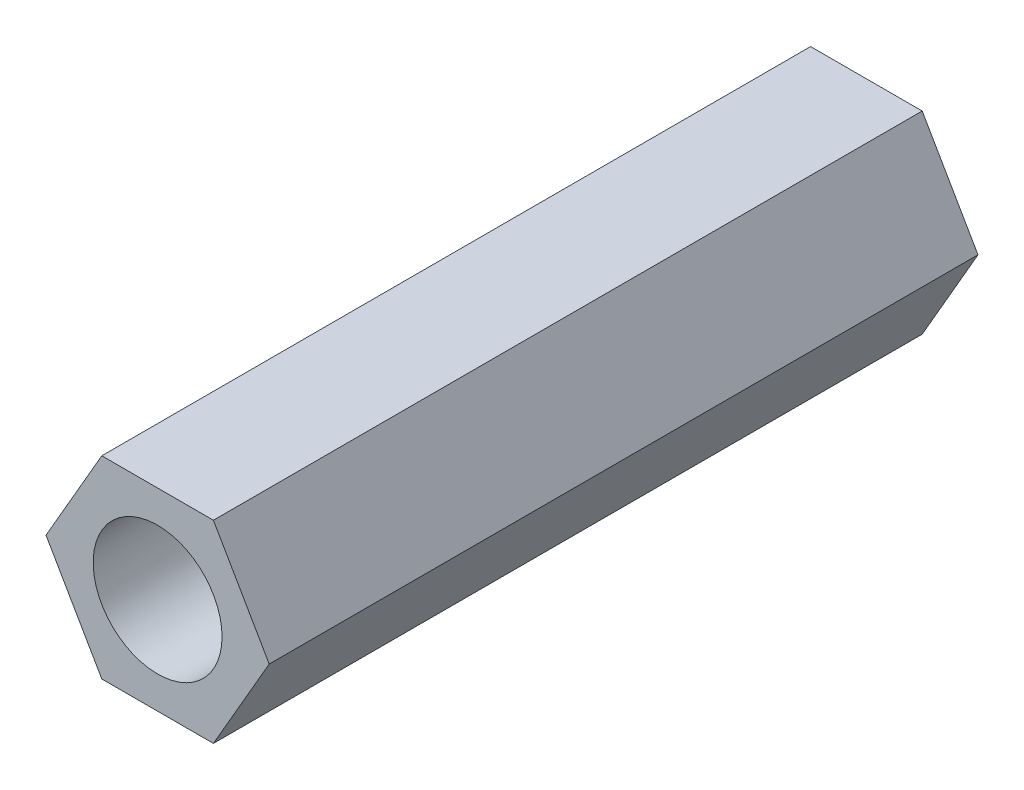
ISO-10303-21;
HEADER;
FILE_DESCRIPTION(('STEP AP214'),'2;1');
FILE_NAME('part.step','',(''),(''),'','','');
FILE_SCHEMA(('AUTOMOTIVE_DESIGN { 1 0 10303 214 1 1 1 1 }'));
ENDSEC;
DATA;
#1=APPLICATION_CONTEXT('core data for automotive mechanical design processes');
#2=APPLICATION_PROTOCOL_DEFINITION('international standard','automotive_design',2000,#1);
#3=PRODUCT_CONTEXT('',#1,'mechanical');
#4=PRODUCT('Part','Part','',(#3));
#5=PRODUCT_RELATED_PRODUCT_CATEGORY('part','',(#4));
#6=PRODUCT_DEFINITION_FORMATION('','',#4);
#7=PRODUCT_DEFINITION_CONTEXT('part definition',#1,'design');
#8=PRODUCT_DEFINITION('design','',#6,#7);
#9=PRODUCT_DEFINITION_SHAPE('','',#8);
#10=(LENGTH_UNIT() NAMED_UNIT(*) SI_UNIT(.MILLI.,.METRE.));
#11=(NAMED_UNIT(*) PLANE_ANGLE_UNIT() SI_UNIT($,.RADIAN.));
#12=(NAMED_UNIT(*) SI_UNIT($,.STERADIAN.) SOLID_ANGLE_UNIT());
#13=UNCERTAINTY_MEASURE_WITH_UNIT(LENGTH_MEASURE(1.E-05),#10,'distance_accuracy_value','');
#14=(GEOMETRIC_REPRESENTATION_CONTEXT(3) GLOBAL_UNCERTAINTY_ASSIGNED_CONTEXT((#13)) GLOBAL_UNIT_ASSIGNED_CONTEXT((#10,
#11,#12)) REPRESENTATION_CONTEXT('',''));
#15=CARTESIAN_POINT('',(0.,0.,0.));
#16=DIRECTION('',(0.,0.,1.));
#17=DIRECTION('',(1.,0.,0.));
#18=AXIS2_PLACEMENT_3D('',#15,#16,#17);
#19=CARTESIAN_POINT('',(0.,0.,22.));
#20=DIRECTION('',(0.,0.,1.));
#21=DIRECTION('',(1.,0.,0.));
#22=AXIS2_PLACEMENT_3D('',#19,#20,#21);
#23=PLANE('',#22);
#24=DIRECTION('',(-0.5,-0.866025403784439,0.));
#25=VECTOR('',#24,1.);
#26=CARTESIAN_POINT('',(-1.73205080756888,3.,22.));
#27=LINE('',#26,#25);
#28=CARTESIAN_POINT('',(-1.73205080756888,3.,22.));
#29=VERTEX_POINT('',#28);
#30=CARTESIAN_POINT('',(-3.46410161513775,0.,22.));
#31=VERTEX_POINT('',#30);
#32=EDGE_CURVE('E130',#29,#31,#27,.T.);
#33=ORIENTED_EDGE('',*,*,#32,.T.);
#34=DIRECTION('',(0.5,-0.866025403784439,0.));
#35=VECTOR('',#34,1.);
#36=CARTESIAN_POINT('',(-3.46410161513775,0.,22.));
#37=LINE('',#36,#35);
#38=CARTESIAN_POINT('',(-1.73205080756888,-3.,22.));
#39=VERTEX_POINT('',#38);
#40=EDGE_CURVE('E88',#31,#39,#37,.T.);
#41=ORIENTED_EDGE('',*,*,#40,.T.);
#42=DIRECTION('',(1.,0.,0.));
#43=VECTOR('',#42,1.);
#44=CARTESIAN_POINT('',(-1.73205080756888,-3.,22.));
#45=LINE('',#44,#43);
#46=CARTESIAN_POINT('',(1.73205080756888,-3.,22.));
#47=VERTEX_POINT('',#46);
#48=EDGE_CURVE('E101',#39,#47,#45,.T.);
#49=ORIENTED_EDGE('',*,*,#48,.T.);
#50=DIRECTION('',(0.5,0.866025403784439,0.));
#51=VECTOR('',#50,1.);
#52=CARTESIAN_POINT('',(1.73205080756888,-3.,22.));
#53=LINE('',#52,#51);
#54=CARTESIAN_POINT('',(3.46410161513775,0.,22.));
#55=VERTEX_POINT('',#54);
#56=EDGE_CURVE('E95',#47,#55,#53,.T.);
#57=ORIENTED_EDGE('',*,*,#56,.T.);
#58=DIRECTION('',(-0.5,0.866025403784439,0.));
#59=VECTOR('',#58,1.);
#60=CARTESIAN_POINT('',(3.46410161513775,0.,22.));
#61=LINE('',#60,#59);
#62=CARTESIAN_POINT('',(1.73205080756888,3.,22.));
#63=VERTEX_POINT('',#62);
#64=EDGE_CURVE('E99',#55,#63,#61,.T.);
#65=ORIENTED_EDGE('',*,*,#64,.T.);
#66=DIRECTION('',(-1.,0.,0.));
#67=VECTOR('',#66,1.);
#68=CARTESIAN_POINT('',(1.73205080756888,3.,22.));
#69=LINE('',#68,#67);
#70=EDGE_CURVE('E51',#63,#29,#69,.T.);
#71=ORIENTED_EDGE('',*,*,#70,.T.);
#72=EDGE_LOOP('',(#33,#41,#49,#57,#65,#71));
#73=FACE_BOUND('',#72,.T.);
#74=CARTESIAN_POINT('',(0.,0.,22.));
#75=DIRECTION('',(0.,0.,1.));
#76=DIRECTION('',(1.,0.,0.));
#77=AXIS2_PLACEMENT_3D('',#74,#75,#76);
#78=CIRCLE('',#77,2.);
#79=CARTESIAN_POINT('',(2.,0.,22.));
#80=VERTEX_POINT('',#79);
#81=EDGE_CURVE('E123',#80,#80,#78,.T.);
#82=ORIENTED_EDGE('',*,*,#81,.F.);
#83=EDGE_LOOP('',(#82));
#84=FACE_BOUND('',#83,.T.);
#85=ADVANCED_FACE('F34',(#73,#84),#23,.T.);
#86=CARTESIAN_POINT('',(0.,0.,0.));
#87=DIRECTION('',(0.,0.,1.));
#88=DIRECTION('',(1.,0.,0.));
#89=AXIS2_PLACEMENT_3D('',#86,#87,#88);
#90=PLANE('',#89);
#91=DIRECTION('',(-0.5,-0.866025403784439,0.));
#92=VECTOR('',#91,1.);
#93=CARTESIAN_POINT('',(-1.73205080756888,3.,0.));
#94=LINE('',#93,#92);
#95=CARTESIAN_POINT('',(-1.73205080756888,3.,0.));
#96=VERTEX_POINT('',#95);
#97=CARTESIAN_POINT('',(-3.46410161513775,0.,0.));
#98=VERTEX_POINT('',#97);
#99=EDGE_CURVE('E119',#96,#98,#94,.T.);
#100=ORIENTED_EDGE('',*,*,#99,.F.);
#101=DIRECTION('',(-1.,0.,0.));
#102=VECTOR('',#101,1.);
#103=CARTESIAN_POINT('',(1.73205080756888,3.,0.));
#104=LINE('',#103,#102);
#105=CARTESIAN_POINT('',(1.73205080756888,3.,0.));
#106=VERTEX_POINT('',#105);
#107=EDGE_CURVE('E80',#106,#96,#104,.T.);
#108=ORIENTED_EDGE('',*,*,#107,.F.);
#109=DIRECTION('',(-0.5,0.866025403784439,0.));
#110=VECTOR('',#109,1.);
#111=CARTESIAN_POINT('',(3.46410161513775,0.,0.));
#112=LINE('',#111,#110);
#113=CARTESIAN_POINT('',(3.46410161513775,0.,0.));
#114=VERTEX_POINT('',#113);
#115=EDGE_CURVE('E74',#114,#106,#112,.T.);
#116=ORIENTED_EDGE('',*,*,#115,.F.);
#117=DIRECTION('',(0.5,0.866025403784439,0.));
#118=VECTOR('',#117,1.);
#119=CARTESIAN_POINT('',(1.73205080756888,-3.,0.));
#120=LINE('',#119,#118);
#121=CARTESIAN_POINT('',(1.73205080756888,-3.,0.));
#122=VERTEX_POINT('',#121);
#123=EDGE_CURVE('E109',#122,#114,#120,.T.);
#124=ORIENTED_EDGE('',*,*,#123,.F.);
#125=DIRECTION('',(1.,0.,0.));
#126=VECTOR('',#125,1.);
#127=CARTESIAN_POINT('',(-1.73205080756888,-3.,0.));
#128=LINE('',#127,#126);
#129=CARTESIAN_POINT('',(-1.73205080756888,-3.,0.));
#130=VERTEX_POINT('',#129);
#131=EDGE_CURVE('E125',#130,#122,#128,.T.);
#132=ORIENTED_EDGE('',*,*,#131,.F.);
#133=DIRECTION('',(0.5,-0.866025403784439,0.));
#134=VECTOR('',#133,1.);
#135=CARTESIAN_POINT('',(-3.46410161513775,0.,0.));
#136=LINE('',#135,#134);
#137=EDGE_CURVE('E122',#98,#130,#136,.T.);
#138=ORIENTED_EDGE('',*,*,#137,.F.);
#139=EDGE_LOOP('',(#100,#108,#116,#124,#132,#138));
#140=FACE_BOUND('',#139,.T.);
#141=CARTESIAN_POINT('',(0.,0.,0.));
#142=DIRECTION('',(0.,0.,1.));
#143=DIRECTION('',(1.,0.,0.));
#144=AXIS2_PLACEMENT_3D('',#141,#142,#143);
#145=CIRCLE('',#144,2.);
#146=CARTESIAN_POINT('',(2.,0.,0.));
#147=VERTEX_POINT('',#146);
#148=EDGE_CURVE('E223',#147,#147,#145,.T.);
#149=ORIENTED_EDGE('',*,*,#148,.T.);
#150=EDGE_LOOP('',(#149));
#151=FACE_BOUND('',#150,.T.);
#152=ADVANCED_FACE('F139',(#140,#151),#90,.F.);
#153=CARTESIAN_POINT('',(-1.73205080756888,3.,22.));
#154=DIRECTION('',(0.866025403784439,-0.5,0.));
#155=DIRECTION('',(0.5,0.866025403784439,0.));
#156=AXIS2_PLACEMENT_3D('',#153,#154,#155);
#157=PLANE('',#156);
#158=ORIENTED_EDGE('',*,*,#99,.T.);
#159=DIRECTION('',(0.,0.,-1.));
#160=VECTOR('',#159,1.);
#161=CARTESIAN_POINT('',(-3.46410161513775,0.,22.));
#162=LINE('',#161,#160);
#163=EDGE_CURVE('E11',#31,#98,#162,.T.);
#164=ORIENTED_EDGE('',*,*,#163,.F.);
#165=ORIENTED_EDGE('',*,*,#32,.F.);
#166=DIRECTION('',(0.,0.,-1.));
#167=VECTOR('',#166,1.);
#168=CARTESIAN_POINT('',(-1.73205080756888,3.,22.));
#169=LINE('',#168,#167);
#170=EDGE_CURVE('E115',#29,#96,#169,.T.);
#171=ORIENTED_EDGE('',*,*,#170,.T.);
#172=EDGE_LOOP('',(#158,#164,#165,#171));
#173=FACE_BOUND('',#172,.T.);
#174=ADVANCED_FACE('F36',(#173),#157,.F.);
#175=CARTESIAN_POINT('',(-3.46410161513775,0.,22.));
#176=DIRECTION('',(0.866025403784439,0.5,0.));
#177=DIRECTION('',(-0.5,0.866025403784439,0.));
#178=AXIS2_PLACEMENT_3D('',#175,#176,#177);
#179=PLANE('',#178);
#180=ORIENTED_EDGE('',*,*,#137,.T.);
#181=DIRECTION('',(0.,0.,-1.));
#182=VECTOR('',#181,1.);
#183=CARTESIAN_POINT('',(-1.73205080756888,-3.,22.));
#184=LINE('',#183,#182);
#185=EDGE_CURVE('E43',#39,#130,#184,.T.);
#186=ORIENTED_EDGE('',*,*,#185,.F.);
#187=ORIENTED_EDGE('',*,*,#40,.F.);
#188=ORIENTED_EDGE('',*,*,#163,.T.);
#189=EDGE_LOOP('',(#180,#186,#187,#188));
#190=FACE_BOUND('',#189,.T.);
#191=ADVANCED_FACE('F164',(#190),#179,.F.);
#192=CARTESIAN_POINT('',(-1.73205080756888,-3.,22.));
#193=DIRECTION('',(0.,1.,0.));
#194=DIRECTION('',(0.,0.,1.));
#195=AXIS2_PLACEMENT_3D('',#192,#193,#194);
#196=PLANE('',#195);
#197=ORIENTED_EDGE('',*,*,#131,.T.);
#198=DIRECTION('',(0.,0.,-1.));
#199=VECTOR('',#198,1.);
#200=CARTESIAN_POINT('',(1.73205080756888,-3.,22.));
#201=LINE('',#200,#199);
#202=EDGE_CURVE('E110',#47,#122,#201,.T.);
#203=ORIENTED_EDGE('',*,*,#202,.F.);
#204=ORIENTED_EDGE('',*,*,#48,.F.);
#205=ORIENTED_EDGE('',*,*,#185,.T.);
#206=EDGE_LOOP('',(#197,#203,#204,#205));
#207=FACE_BOUND('',#206,.T.);
#208=ADVANCED_FACE('F136',(#207),#196,.F.);
#209=CARTESIAN_POINT('',(1.73205080756888,-3.,22.));
#210=DIRECTION('',(-0.866025403784439,0.5,0.));
#211=DIRECTION('',(-0.5,-0.866025403784439,0.));
#212=AXIS2_PLACEMENT_3D('',#209,#210,#211);
#213=PLANE('',#212);
#214=ORIENTED_EDGE('',*,*,#123,.T.);
#215=DIRECTION('',(0.,0.,-1.));
#216=VECTOR('',#215,1.);
#217=CARTESIAN_POINT('',(3.46410161513775,0.,22.));
#218=LINE('',#217,#216);
#219=EDGE_CURVE('E106',#55,#114,#218,.T.);
#220=ORIENTED_EDGE('',*,*,#219,.F.);
#221=ORIENTED_EDGE('',*,*,#56,.F.);
#222=ORIENTED_EDGE('',*,*,#202,.T.);
#223=EDGE_LOOP('',(#214,#220,#221,#222));
#224=FACE_BOUND('',#223,.T.);
#225=ADVANCED_FACE('F107',(#224),#213,.F.);
#226=CARTESIAN_POINT('',(3.46410161513775,0.,22.));
#227=DIRECTION('',(-0.866025403784439,-0.5,0.));
#228=DIRECTION('',(0.5,-0.866025403784439,0.));
#229=AXIS2_PLACEMENT_3D('',#226,#227,#228);
#230=PLANE('',#229);
#231=ORIENTED_EDGE('',*,*,#115,.T.);
#232=DIRECTION('',(0.,0.,-1.));
#233=VECTOR('',#232,1.);
#234=CARTESIAN_POINT('',(1.73205080756888,3.,22.));
#235=LINE('',#234,#233);
#236=EDGE_CURVE('E111',#63,#106,#235,.T.);
#237=ORIENTED_EDGE('',*,*,#236,.F.);
#238=ORIENTED_EDGE('',*,*,#64,.F.);
#239=ORIENTED_EDGE('',*,*,#219,.T.);
#240=EDGE_LOOP('',(#231,#237,#238,#239));
#241=FACE_BOUND('',#240,.T.);
#242=ADVANCED_FACE('F113',(#241),#230,.F.);
#243=CARTESIAN_POINT('',(1.73205080756888,3.,22.));
#244=DIRECTION('',(0.,-1.,0.));
#245=DIRECTION('',(1.,0.,0.));
#246=AXIS2_PLACEMENT_3D('',#243,#244,#245);
#247=PLANE('',#246);
#248=ORIENTED_EDGE('',*,*,#107,.T.);
#249=ORIENTED_EDGE('',*,*,#170,.F.);
#250=ORIENTED_EDGE('',*,*,#70,.F.);
#251=ORIENTED_EDGE('',*,*,#236,.T.);
#252=EDGE_LOOP('',(#248,#249,#250,#251));
#253=FACE_BOUND('',#252,.T.);
#254=ADVANCED_FACE('F144',(#253),#247,.F.);
#255=CARTESIAN_POINT('',(0.,0.,22.));
#256=DIRECTION('',(0.,0.,-1.));
#257=DIRECTION('',(-1.,0.,0.));
#258=AXIS2_PLACEMENT_3D('',#255,#256,#257);
#259=CYLINDRICAL_SURFACE('',#258,2.);
#260=ORIENTED_EDGE('',*,*,#81,.T.);
#261=EDGE_LOOP('',(#260));
#262=FACE_BOUND('',#261,.T.);
#263=ORIENTED_EDGE('',*,*,#148,.F.);
#264=EDGE_LOOP('',(#263));
#265=FACE_BOUND('',#264,.T.);
#266=ADVANCED_FACE('F146',(#262,#265),#259,.F.);
#267=CLOSED_SHELL('',(#85,#152,#174,#191,#208,#225,#242,#254,#266));
#268=MANIFOLD_SOLID_BREP('B2',#267);
#269=ADVANCED_BREP_SHAPE_REPRESENTATION('',(#18,#268),#14);
#270=SHAPE_DEFINITION_REPRESENTATION(#9,#269);
ENDSEC;
END-ISO-10303-21;
